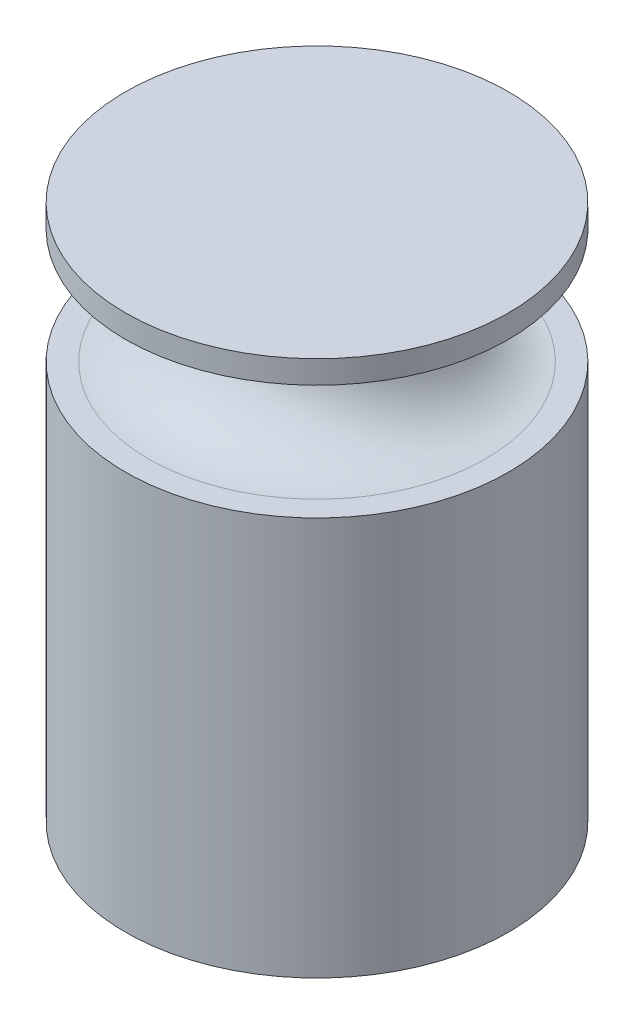
ISO-10303-21;
HEADER;
FILE_DESCRIPTION(('STEP AP214'),'2;1');
FILE_NAME('part.step','',(''),(''),'','','');
FILE_SCHEMA(('AUTOMOTIVE_DESIGN { 1 0 10303 214 1 1 1 1 }'));
ENDSEC;
DATA;
#1=APPLICATION_CONTEXT('core data for automotive mechanical design processes');
#2=APPLICATION_PROTOCOL_DEFINITION('international standard','automotive_design',2000,#1);
#3=PRODUCT_CONTEXT('',#1,'mechanical');
#4=PRODUCT('Part','Part','',(#3));
#5=PRODUCT_RELATED_PRODUCT_CATEGORY('part','',(#4));
#6=PRODUCT_DEFINITION_FORMATION('','',#4);
#7=PRODUCT_DEFINITION_CONTEXT('part definition',#1,'design');
#8=PRODUCT_DEFINITION('design','',#6,#7);
#9=PRODUCT_DEFINITION_SHAPE('','',#8);
#10=(LENGTH_UNIT() NAMED_UNIT(*) SI_UNIT(.MILLI.,.METRE.));
#11=(NAMED_UNIT(*) PLANE_ANGLE_UNIT() SI_UNIT($,.RADIAN.));
#12=(NAMED_UNIT(*) SI_UNIT($,.STERADIAN.) SOLID_ANGLE_UNIT());
#13=UNCERTAINTY_MEASURE_WITH_UNIT(LENGTH_MEASURE(1.E-05),#10,'distance_accuracy_value','');
#14=(GEOMETRIC_REPRESENTATION_CONTEXT(3) GLOBAL_UNCERTAINTY_ASSIGNED_CONTEXT((#13)) GLOBAL_UNIT_ASSIGNED_CONTEXT((#10,
#11,#12)) REPRESENTATION_CONTEXT('',''));
#15=CARTESIAN_POINT('',(0.,0.,0.));
#16=DIRECTION('',(0.,0.,1.));
#17=DIRECTION('',(1.,0.,0.));
#18=AXIS2_PLACEMENT_3D('',#15,#16,#17);
#19=CARTESIAN_POINT('',(0.,52.,0.));
#20=DIRECTION('',(0.,-1.,0.));
#21=DIRECTION('',(0.,0.,-1.));
#22=AXIS2_PLACEMENT_3D('',#19,#20,#21);
#23=CYLINDRICAL_SURFACE('',#22,25.);
#24=CARTESIAN_POINT('',(0.,52.,0.));
#25=DIRECTION('',(0.,1.,0.));
#26=DIRECTION('',(0.,0.,1.));
#27=AXIS2_PLACEMENT_3D('',#24,#25,#26);
#28=CIRCLE('',#27,25.);
#29=CARTESIAN_POINT('',(0.,52.,-25.));
#30=VERTEX_POINT('',#29);
#31=EDGE_CURVE('E55',#30,#30,#28,.T.);
#32=CARTESIAN_POINT('',(0.,0.,0.));
#33=DIRECTION('',(0.,1.,0.));
#34=DIRECTION('',(0.,0.,1.));
#35=AXIS2_PLACEMENT_3D('',#32,#33,#34);
#36=CIRCLE('',#35,25.);
#37=CARTESIAN_POINT('',(0.,0.,-25.));
#38=VERTEX_POINT('',#37);
#39=EDGE_CURVE('E58',#38,#38,#36,.T.);
#40=CARTESIAN_POINT('',(0.,52.,-25.));
#41=CARTESIAN_POINT('',(0.,51.4583333333333,-25.));
#42=CARTESIAN_POINT('',(0.,50.9166666666667,-25.));
#43=CARTESIAN_POINT('',(0.,49.8333333333333,-25.));
#44=CARTESIAN_POINT('',(0.,49.2916666666667,-25.));
#45=CARTESIAN_POINT('',(0.,48.2083333333333,-25.));
#46=CARTESIAN_POINT('',(0.,47.6666666666667,-25.));
#47=CARTESIAN_POINT('',(0.,46.5833333333333,-25.));
#48=CARTESIAN_POINT('',(0.,46.0416666666667,-25.));
#49=CARTESIAN_POINT('',(0.,44.9583333333333,-25.));
#50=CARTESIAN_POINT('',(0.,44.4166666666667,-25.));
#51=CARTESIAN_POINT('',(0.,43.3333333333333,-25.));
#52=CARTESIAN_POINT('',(0.,42.7916666666667,-25.));
#53=CARTESIAN_POINT('',(0.,41.7083333333333,-25.));
#54=CARTESIAN_POINT('',(0.,41.1666666666667,-25.));
#55=CARTESIAN_POINT('',(0.,40.0833333333333,-25.));
#56=CARTESIAN_POINT('',(0.,39.5416666666667,-25.));
#57=CARTESIAN_POINT('',(0.,38.4583333333333,-25.));
#58=CARTESIAN_POINT('',(0.,37.9166666666667,-25.));
#59=CARTESIAN_POINT('',(0.,36.8333333333333,-25.));
#60=CARTESIAN_POINT('',(0.,36.2916666666667,-25.));
#61=CARTESIAN_POINT('',(0.,35.2083333333333,-25.));
#62=CARTESIAN_POINT('',(0.,34.6666666666667,-25.));
#63=CARTESIAN_POINT('',(0.,33.5833333333333,-25.));
#64=CARTESIAN_POINT('',(0.,33.0416666666667,-25.));
#65=CARTESIAN_POINT('',(0.,31.9583333333333,-25.));
#66=CARTESIAN_POINT('',(0.,31.4166666666667,-25.));
#67=CARTESIAN_POINT('',(0.,30.3333333333333,-25.));
#68=CARTESIAN_POINT('',(0.,29.7916666666667,-25.));
#69=CARTESIAN_POINT('',(0.,28.7083333333333,-25.));
#70=CARTESIAN_POINT('',(0.,28.1666666666667,-25.));
#71=CARTESIAN_POINT('',(0.,27.0833333333333,-25.));
#72=CARTESIAN_POINT('',(0.,26.5416666666667,-25.));
#73=CARTESIAN_POINT('',(0.,25.4583333333333,-25.));
#74=CARTESIAN_POINT('',(0.,24.9166666666667,-25.));
#75=CARTESIAN_POINT('',(0.,23.8333333333333,-25.));
#76=CARTESIAN_POINT('',(0.,23.2916666666667,-25.));
#77=CARTESIAN_POINT('',(0.,22.2083333333333,-25.));
#78=CARTESIAN_POINT('',(0.,21.6666666666667,-25.));
#79=CARTESIAN_POINT('',(0.,20.5833333333333,-25.));
#80=CARTESIAN_POINT('',(0.,20.0416666666667,-25.));
#81=CARTESIAN_POINT('',(0.,18.9583333333333,-25.));
#82=CARTESIAN_POINT('',(0.,18.4166666666667,-25.));
#83=CARTESIAN_POINT('',(0.,17.3333333333333,-25.));
#84=CARTESIAN_POINT('',(0.,16.7916666666667,-25.));
#85=CARTESIAN_POINT('',(0.,15.7083333333333,-25.));
#86=CARTESIAN_POINT('',(0.,15.1666666666667,-25.));
#87=CARTESIAN_POINT('',(0.,14.0833333333333,-25.));
#88=CARTESIAN_POINT('',(0.,13.5416666666667,-25.));
#89=CARTESIAN_POINT('',(0.,12.4583333333333,-25.));
#90=CARTESIAN_POINT('',(0.,11.9166666666667,-25.));
#91=CARTESIAN_POINT('',(0.,10.8333333333333,-25.));
#92=CARTESIAN_POINT('',(0.,10.2916666666667,-25.));
#93=CARTESIAN_POINT('',(0.,9.20833333333333,-25.));
#94=CARTESIAN_POINT('',(0.,8.66666666666667,-25.));
#95=CARTESIAN_POINT('',(0.,7.58333333333333,-25.));
#96=CARTESIAN_POINT('',(0.,7.04166666666667,-25.));
#97=CARTESIAN_POINT('',(0.,5.95833333333333,-25.));
#98=CARTESIAN_POINT('',(0.,5.41666666666667,-25.));
#99=CARTESIAN_POINT('',(0.,4.33333333333333,-25.));
#100=CARTESIAN_POINT('',(0.,3.79166666666667,-25.));
#101=CARTESIAN_POINT('',(0.,2.70833333333334,-25.));
#102=CARTESIAN_POINT('',(0.,2.16666666666667,-25.));
#103=CARTESIAN_POINT('',(0.,1.08333333333333,-25.));
#104=CARTESIAN_POINT('',(0.,0.541666666666667,-25.));
#105=CARTESIAN_POINT('',(0.,0.,-25.));
#106=B_SPLINE_CURVE_WITH_KNOTS('',3,(#40,#41,#42,#43,#44,#45,#46,#47,#48,#49,#50,#51,#52,#53,
#54,#55,#56,#57,#58,#59,#60,#61,#62,#63,#64,#65,#66,#67,#68,#69,#70,#71,#72,#73,#74,#75,#76,#77,
#78,#79,#80,#81,#82,#83,#84,#85,#86,#87,#88,#89,#90,#91,#92,#93,#94,#95,#96,#97,#98,#99,#100,
#101,#102,#103,#104,#105),.UNSPECIFIED.,.F.,.F.,(4,2,2,2,2,2,2,2,2,2,2,2,2,2,2,2,2,2,2,2,2,2,2,
2,2,2,2,2,2,2,2,2,4),(0.,1.62499999999999,3.25,4.875,6.49999999999999,8.12499999999999,
9.74999999999999,11.375,13.,14.625,16.25,17.875,19.5,21.125,22.75,24.375,26.,27.625,29.25,
30.875,32.5,34.125,35.75,37.375,39.,40.625,42.25,43.875,45.5,47.125,48.75,50.375,52.),.UNSPECIFIED.);
#107=EDGE_CURVE('BSEAM37',#30,#38,#106,.T.);
#108=ORIENTED_EDGE('',*,*,#31,.F.);
#109=ORIENTED_EDGE('',*,*,#39,.T.);
#110=ORIENTED_EDGE('',*,*,#107,.T.);
#111=ORIENTED_EDGE('',*,*,#107,.F.);
#112=EDGE_LOOP('',(#108,#110,#109,#111));
#113=FACE_BOUND('',#112,.T.);
#114=ADVANCED_FACE('F37',(#113),#23,.T.);
#115=CARTESIAN_POINT('',(0.,52.,0.));
#116=DIRECTION('',(0.,1.,0.));
#117=DIRECTION('',(0.,0.,1.));
#118=AXIS2_PLACEMENT_3D('',#115,#116,#117);
#119=PLANE('',#118);
#120=CARTESIAN_POINT('',(0.,52.,0.));
#121=DIRECTION('',(0.,1.,0.));
#122=DIRECTION('',(0.,0.,1.));
#123=AXIS2_PLACEMENT_3D('',#120,#121,#122);
#124=CIRCLE('',#123,22.);
#125=CARTESIAN_POINT('',(0.,52.,22.));
#126=VERTEX_POINT('',#125);
#127=EDGE_CURVE('E45',#126,#126,#124,.F.);
#128=ORIENTED_EDGE('',*,*,#127,.T.);
#129=EDGE_LOOP('',(#128));
#130=FACE_BOUND('',#129,.T.);
#131=ORIENTED_EDGE('',*,*,#31,.T.);
#132=EDGE_LOOP('',(#131));
#133=FACE_BOUND('',#132,.T.);
#134=ADVANCED_FACE('F94',(#130,#133),#119,.T.);
#135=CARTESIAN_POINT('',(0.,0.,0.));
#136=DIRECTION('',(0.,1.,0.));
#137=DIRECTION('',(0.,0.,1.));
#138=AXIS2_PLACEMENT_3D('',#135,#136,#137);
#139=PLANE('',#138);
#140=CARTESIAN_POINT('',(0.,0.,0.));
#141=DIRECTION('',(0.,-1.,0.));
#142=DIRECTION('',(0.,0.,-1.));
#143=AXIS2_PLACEMENT_3D('',#140,#141,#142);
#144=CIRCLE('',#143,20.);
#145=CARTESIAN_POINT('',(0.,0.,-20.));
#146=VERTEX_POINT('',#145);
#147=EDGE_CURVE('E74',#146,#146,#144,.T.);
#148=ORIENTED_EDGE('',*,*,#147,.F.);
#149=EDGE_LOOP('',(#148));
#150=FACE_BOUND('',#149,.T.);
#151=ORIENTED_EDGE('',*,*,#39,.F.);
#152=EDGE_LOOP('',(#151));
#153=FACE_BOUND('',#152,.T.);
#154=ADVANCED_FACE('F90',(#150,#153),#139,.F.);
#155=CARTESIAN_POINT('',(0.,70.,0.));
#156=DIRECTION('',(0.,-1.,0.));
#157=DIRECTION('',(0.,0.,-1.));
#158=AXIS2_PLACEMENT_3D('',#155,#156,#157);
#159=CYLINDRICAL_SURFACE('',#158,25.);
#160=CARTESIAN_POINT('',(0.,70.,0.));
#161=DIRECTION('',(0.,1.,0.));
#162=DIRECTION('',(0.,0.,1.));
#163=AXIS2_PLACEMENT_3D('',#160,#161,#162);
#164=CIRCLE('',#163,25.);
#165=CARTESIAN_POINT('',(0.,70.,25.));
#166=VERTEX_POINT('',#165);
#167=EDGE_CURVE('E62',#166,#166,#164,.T.);
#168=ORIENTED_EDGE('',*,*,#167,.F.);
#169=EDGE_LOOP('',(#168));
#170=FACE_BOUND('',#169,.T.);
#171=CARTESIAN_POINT('',(0.,67.,0.));
#172=DIRECTION('',(0.,1.,0.));
#173=DIRECTION('',(0.,0.,1.));
#174=AXIS2_PLACEMENT_3D('',#171,#172,#173);
#175=CIRCLE('',#174,25.);
#176=CARTESIAN_POINT('',(0.,67.,25.));
#177=VERTEX_POINT('',#176);
#178=EDGE_CURVE('E66',#177,#177,#175,.T.);
#179=ORIENTED_EDGE('',*,*,#178,.T.);
#180=EDGE_LOOP('',(#179));
#181=FACE_BOUND('',#180,.T.);
#182=ADVANCED_FACE('F93',(#170,#181),#159,.T.);
#183=CARTESIAN_POINT('',(0.,70.,0.));
#184=DIRECTION('',(0.,1.,0.));
#185=DIRECTION('',(0.,0.,1.));
#186=AXIS2_PLACEMENT_3D('',#183,#184,#185);
#187=PLANE('',#186);
#188=ORIENTED_EDGE('',*,*,#167,.T.);
#189=EDGE_LOOP('',(#188));
#190=FACE_BOUND('',#189,.T.);
#191=ADVANCED_FACE('F115',(#190),#187,.T.);
#192=CARTESIAN_POINT('',(0.,67.,0.));
#193=DIRECTION('',(0.,1.,0.));
#194=DIRECTION('',(0.,0.,1.));
#195=AXIS2_PLACEMENT_3D('',#192,#193,#194);
#196=PLANE('',#195);
#197=CARTESIAN_POINT('',(0.,67.,0.));
#198=DIRECTION('',(0.,1.,0.));
#199=DIRECTION('',(0.,0.,1.));
#200=AXIS2_PLACEMENT_3D('',#197,#198,#199);
#201=CIRCLE('',#200,20.6602540378444);
#202=CARTESIAN_POINT('',(0.,67.,20.6602540378444));
#203=VERTEX_POINT('',#202);
#204=EDGE_CURVE('E10',#203,#203,#201,.T.);
#205=ORIENTED_EDGE('',*,*,#204,.T.);
#206=EDGE_LOOP('',(#205));
#207=FACE_BOUND('',#206,.T.);
#208=ORIENTED_EDGE('',*,*,#178,.F.);
#209=EDGE_LOOP('',(#208));
#210=FACE_BOUND('',#209,.T.);
#211=ADVANCED_FACE('F108',(#207,#210),#196,.F.);
#212=CARTESIAN_POINT('',(0.,62.,0.));
#213=DIRECTION('',(0.,1.,0.));
#214=DIRECTION('',(0.,0.,1.));
#215=AXIS2_PLACEMENT_3D('',#212,#213,#214);
#216=TOROIDAL_SURFACE('',#215,22.,10.);
#217=ORIENTED_EDGE('',*,*,#127,.F.);
#218=EDGE_LOOP('',(#217));
#219=FACE_BOUND('',#218,.T.);
#220=CARTESIAN_POINT('',(0.,62.,0.));
#221=DIRECTION('',(0.,1.,0.));
#222=DIRECTION('',(0.,0.,1.));
#223=AXIS2_PLACEMENT_3D('',#220,#221,#222);
#224=CIRCLE('',#223,12.);
#225=CARTESIAN_POINT('',(0.,62.,12.));
#226=VERTEX_POINT('',#225);
#227=EDGE_CURVE('E50',#226,#226,#224,.T.);
#228=ORIENTED_EDGE('',*,*,#227,.F.);
#229=EDGE_LOOP('',(#228));
#230=FACE_BOUND('',#229,.T.);
#231=ADVANCED_FACE('F106',(#219,#230),#216,.F.);
#232=CARTESIAN_POINT('',(0.,57.,0.));
#233=DIRECTION('',(0.,1.,0.));
#234=DIRECTION('',(0.,0.,1.));
#235=AXIS2_PLACEMENT_3D('',#232,#233,#234);
#236=TOROIDAL_SURFACE('',#235,20.6602540378444,10.);
#237=ORIENTED_EDGE('',*,*,#227,.T.);
#238=EDGE_LOOP('',(#237));
#239=FACE_BOUND('',#238,.T.);
#240=ORIENTED_EDGE('',*,*,#204,.F.);
#241=EDGE_LOOP('',(#240));
#242=FACE_BOUND('',#241,.T.);
#243=ADVANCED_FACE('F39',(#239,#242),#236,.F.);
#244=CARTESIAN_POINT('',(0.,18.,0.));
#245=DIRECTION('',(0.,-1.,0.));
#246=DIRECTION('',(0.,0.,-1.));
#247=AXIS2_PLACEMENT_3D('',#244,#245,#246);
#248=CYLINDRICAL_SURFACE('',#247,20.);
#249=CARTESIAN_POINT('',(0.,18.,0.));
#250=DIRECTION('',(0.,-1.,0.));
#251=DIRECTION('',(0.,0.,-1.));
#252=AXIS2_PLACEMENT_3D('',#249,#250,#251);
#253=CIRCLE('',#252,20.);
#254=CARTESIAN_POINT('',(0.,18.,-20.));
#255=VERTEX_POINT('',#254);
#256=EDGE_CURVE('E70',#255,#255,#253,.T.);
#257=ORIENTED_EDGE('',*,*,#256,.F.);
#258=EDGE_LOOP('',(#257));
#259=FACE_BOUND('',#258,.T.);
#260=ORIENTED_EDGE('',*,*,#147,.T.);
#261=EDGE_LOOP('',(#260));
#262=FACE_BOUND('',#261,.T.);
#263=ADVANCED_FACE('F84',(#259,#262),#248,.F.);
#264=CARTESIAN_POINT('',(0.,18.,0.));
#265=DIRECTION('',(0.,-1.,0.));
#266=DIRECTION('',(0.,0.,-1.));
#267=AXIS2_PLACEMENT_3D('',#264,#265,#266);
#268=PLANE('',#267);
#269=ORIENTED_EDGE('',*,*,#256,.T.);
#270=EDGE_LOOP('',(#269));
#271=FACE_BOUND('',#270,.T.);
#272=ADVANCED_FACE('F82',(#271),#268,.T.);
#273=CLOSED_SHELL('',(#114,#134,#154,#182,#191,#211,#231,#243,#263,#272));
#274=MANIFOLD_SOLID_BREP('B2',#273);
#275=ADVANCED_BREP_SHAPE_REPRESENTATION('',(#18,#274),#14);
#276=SHAPE_DEFINITION_REPRESENTATION(#9,#275);
ENDSEC;
END-ISO-10303-21;
